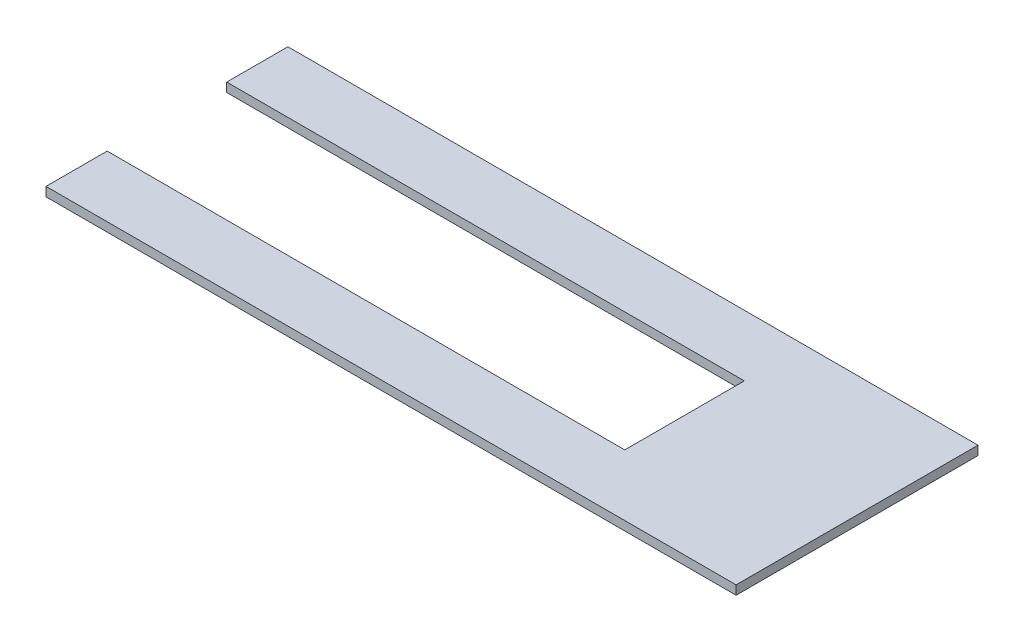
ISO-10303-21;
HEADER;
FILE_DESCRIPTION(('STEP AP214'),'2;1');
FILE_NAME('part.step','',(''),(''),'','','');
FILE_SCHEMA(('AUTOMOTIVE_DESIGN { 1 0 10303 214 1 1 1 1 }'));
ENDSEC;
DATA;
#1=APPLICATION_CONTEXT('core data for automotive mechanical design processes');
#2=APPLICATION_PROTOCOL_DEFINITION('international standard','automotive_design',2000,#1);
#3=PRODUCT_CONTEXT('',#1,'mechanical');
#4=PRODUCT('Part','Part','',(#3));
#5=PRODUCT_RELATED_PRODUCT_CATEGORY('part','',(#4));
#6=PRODUCT_DEFINITION_FORMATION('','',#4);
#7=PRODUCT_DEFINITION_CONTEXT('part definition',#1,'design');
#8=PRODUCT_DEFINITION('design','',#6,#7);
#9=PRODUCT_DEFINITION_SHAPE('','',#8);
#10=(LENGTH_UNIT() NAMED_UNIT(*) SI_UNIT(.MILLI.,.METRE.));
#11=(NAMED_UNIT(*) PLANE_ANGLE_UNIT() SI_UNIT($,.RADIAN.));
#12=(NAMED_UNIT(*) SI_UNIT($,.STERADIAN.) SOLID_ANGLE_UNIT());
#13=UNCERTAINTY_MEASURE_WITH_UNIT(LENGTH_MEASURE(1.E-05),#10,'distance_accuracy_value','');
#14=(GEOMETRIC_REPRESENTATION_CONTEXT(3) GLOBAL_UNCERTAINTY_ASSIGNED_CONTEXT((#13)) GLOBAL_UNIT_ASSIGNED_CONTEXT((#10,
#11,#12)) REPRESENTATION_CONTEXT('',''));
#15=CARTESIAN_POINT('',(0.,0.,0.));
#16=DIRECTION('',(0.,0.,1.));
#17=DIRECTION('',(1.,0.,0.));
#18=AXIS2_PLACEMENT_3D('',#15,#16,#17);
#19=CARTESIAN_POINT('',(242.193241980691,12.7,-82.));
#20=DIRECTION('',(1.,0.,0.));
#21=DIRECTION('',(0.,0.,-1.));
#22=AXIS2_PLACEMENT_3D('',#19,#20,#21);
#23=PLANE('',#22);
#24=DIRECTION('',(0.,0.,1.));
#25=VECTOR('',#24,1.);
#26=CARTESIAN_POINT('',(242.193241980691,0.,-82.));
#27=LINE('',#26,#25);
#28=CARTESIAN_POINT('',(242.193241980691,0.,-82.));
#29=VERTEX_POINT('',#28);
#30=CARTESIAN_POINT('',(242.193241980691,0.,86.0000000000002));
#31=VERTEX_POINT('',#30);
#32=EDGE_CURVE('E135',#29,#31,#27,.T.);
#33=ORIENTED_EDGE('',*,*,#32,.T.);
#34=DIRECTION('',(0.,-1.,0.));
#35=VECTOR('',#34,1.);
#36=CARTESIAN_POINT('',(242.193241980691,12.7,86.0000000000002));
#37=LINE('',#36,#35);
#38=CARTESIAN_POINT('',(242.193241980691,12.7,86.0000000000002));
#39=VERTEX_POINT('',#38);
#40=EDGE_CURVE('E11',#39,#31,#37,.T.);
#41=ORIENTED_EDGE('',*,*,#40,.F.);
#42=DIRECTION('',(0.,0.,1.));
#43=VECTOR('',#42,1.);
#44=CARTESIAN_POINT('',(242.193241980691,12.7,-82.));
#45=LINE('',#44,#43);
#46=CARTESIAN_POINT('',(242.193241980691,12.7,-82.));
#47=VERTEX_POINT('',#46);
#48=EDGE_CURVE('E152',#47,#39,#45,.T.);
#49=ORIENTED_EDGE('',*,*,#48,.F.);
#50=DIRECTION('',(0.,-1.,0.));
#51=VECTOR('',#50,1.);
#52=CARTESIAN_POINT('',(242.193241980691,12.7,-82.));
#53=LINE('',#52,#51);
#54=EDGE_CURVE('E134',#47,#29,#53,.T.);
#55=ORIENTED_EDGE('',*,*,#54,.T.);
#56=EDGE_LOOP('',(#33,#41,#49,#55));
#57=FACE_BOUND('',#56,.T.);
#58=ADVANCED_FACE('F37',(#57),#23,.F.);
#59=CARTESIAN_POINT('',(242.193241980691,12.7,86.0000000000002));
#60=DIRECTION('',(0.,0.,1.));
#61=DIRECTION('',(1.,0.,0.));
#62=AXIS2_PLACEMENT_3D('',#59,#60,#61);
#63=PLANE('',#62);
#64=DIRECTION('',(-1.,0.,0.));
#65=VECTOR('',#64,1.);
#66=CARTESIAN_POINT('',(242.193241980691,0.,86.0000000000002));
#67=LINE('',#66,#65);
#68=CARTESIAN_POINT('',(-485.306758019309,0.,86.0000000000002));
#69=VERTEX_POINT('',#68);
#70=EDGE_CURVE('E138',#31,#69,#67,.T.);
#71=ORIENTED_EDGE('',*,*,#70,.T.);
#72=DIRECTION('',(0.,-1.,0.));
#73=VECTOR('',#72,1.);
#74=CARTESIAN_POINT('',(-485.306758019309,12.7,86.0000000000002));
#75=LINE('',#74,#73);
#76=CARTESIAN_POINT('',(-485.306758019309,12.7,86.0000000000002));
#77=VERTEX_POINT('',#76);
#78=EDGE_CURVE('E45',#77,#69,#75,.T.);
#79=ORIENTED_EDGE('',*,*,#78,.F.);
#80=DIRECTION('',(-1.,0.,0.));
#81=VECTOR('',#80,1.);
#82=CARTESIAN_POINT('',(242.193241980691,12.7,86.0000000000002));
#83=LINE('',#82,#81);
#84=EDGE_CURVE('E95',#39,#77,#83,.T.);
#85=ORIENTED_EDGE('',*,*,#84,.F.);
#86=ORIENTED_EDGE('',*,*,#40,.T.);
#87=EDGE_LOOP('',(#71,#79,#85,#86));
#88=FACE_BOUND('',#87,.T.);
#89=ADVANCED_FACE('F180',(#88),#63,.F.);
#90=CARTESIAN_POINT('',(-485.306758019309,12.7,86.0000000000002));
#91=DIRECTION('',(1.,0.,0.));
#92=DIRECTION('',(0.,0.,-1.));
#93=AXIS2_PLACEMENT_3D('',#90,#91,#92);
#94=PLANE('',#93);
#95=DIRECTION('',(0.,0.,1.));
#96=VECTOR('',#95,1.);
#97=CARTESIAN_POINT('',(-485.306758019309,0.,86.0000000000002));
#98=LINE('',#97,#96);
#99=CARTESIAN_POINT('',(-485.306758019309,0.,172.));
#100=VERTEX_POINT('',#99);
#101=EDGE_CURVE('E140',#69,#100,#98,.T.);
#102=ORIENTED_EDGE('',*,*,#101,.T.);
#103=DIRECTION('',(0.,-1.,0.));
#104=VECTOR('',#103,1.);
#105=CARTESIAN_POINT('',(-485.306758019309,12.7,172.));
#106=LINE('',#105,#104);
#107=CARTESIAN_POINT('',(-485.306758019309,12.7,172.));
#108=VERTEX_POINT('',#107);
#109=EDGE_CURVE('E158',#108,#100,#106,.T.);
#110=ORIENTED_EDGE('',*,*,#109,.F.);
#111=DIRECTION('',(0.,0.,1.));
#112=VECTOR('',#111,1.);
#113=CARTESIAN_POINT('',(-485.306758019309,12.7,86.0000000000002));
#114=LINE('',#113,#112);
#115=EDGE_CURVE('E165',#77,#108,#114,.T.);
#116=ORIENTED_EDGE('',*,*,#115,.F.);
#117=ORIENTED_EDGE('',*,*,#78,.T.);
#118=EDGE_LOOP('',(#102,#110,#116,#117));
#119=FACE_BOUND('',#118,.T.);
#120=ADVANCED_FACE('F163',(#119),#94,.F.);
#121=CARTESIAN_POINT('',(484.693241980691,12.7,172.));
#122=DIRECTION('',(0.,0.,1.));
#123=DIRECTION('',(1.,0.,0.));
#124=AXIS2_PLACEMENT_3D('',#121,#122,#123);
#125=PLANE('',#124);
#126=DIRECTION('',(-1.,0.,0.));
#127=VECTOR('',#126,1.);
#128=CARTESIAN_POINT('',(484.693241980691,0.,172.));
#129=LINE('',#128,#127);
#130=CARTESIAN_POINT('',(484.693241980691,0.,172.));
#131=VERTEX_POINT('',#130);
#132=EDGE_CURVE('E143',#131,#100,#129,.T.);
#133=ORIENTED_EDGE('',*,*,#132,.F.);
#134=DIRECTION('',(0.,-1.,0.));
#135=VECTOR('',#134,1.);
#136=CARTESIAN_POINT('',(484.693241980691,12.7,172.));
#137=LINE('',#136,#135);
#138=CARTESIAN_POINT('',(484.693241980691,12.7,172.));
#139=VERTEX_POINT('',#138);
#140=EDGE_CURVE('E156',#139,#131,#137,.T.);
#141=ORIENTED_EDGE('',*,*,#140,.F.);
#142=DIRECTION('',(-1.,0.,0.));
#143=VECTOR('',#142,1.);
#144=CARTESIAN_POINT('',(484.693241980691,12.7,172.));
#145=LINE('',#144,#143);
#146=EDGE_CURVE('E129',#139,#108,#145,.T.);
#147=ORIENTED_EDGE('',*,*,#146,.T.);
#148=ORIENTED_EDGE('',*,*,#109,.T.);
#149=EDGE_LOOP('',(#133,#141,#147,#148));
#150=FACE_BOUND('',#149,.T.);
#151=ADVANCED_FACE('F172',(#150),#125,.T.);
#152=CARTESIAN_POINT('',(484.693241980691,12.7,-168.));
#153=DIRECTION('',(1.,0.,0.));
#154=DIRECTION('',(0.,0.,-1.));
#155=AXIS2_PLACEMENT_3D('',#152,#153,#154);
#156=PLANE('',#155);
#157=DIRECTION('',(0.,0.,1.));
#158=VECTOR('',#157,1.);
#159=CARTESIAN_POINT('',(484.693241980691,0.,-168.));
#160=LINE('',#159,#158);
#161=CARTESIAN_POINT('',(484.693241980691,0.,-168.));
#162=VERTEX_POINT('',#161);
#163=EDGE_CURVE('E146',#162,#131,#160,.T.);
#164=ORIENTED_EDGE('',*,*,#163,.F.);
#165=DIRECTION('',(0.,-1.,0.));
#166=VECTOR('',#165,1.);
#167=CARTESIAN_POINT('',(484.693241980691,12.7,-168.));
#168=LINE('',#167,#166);
#169=CARTESIAN_POINT('',(484.693241980691,12.7,-168.));
#170=VERTEX_POINT('',#169);
#171=EDGE_CURVE('E117',#170,#162,#168,.T.);
#172=ORIENTED_EDGE('',*,*,#171,.F.);
#173=DIRECTION('',(0.,0.,1.));
#174=VECTOR('',#173,1.);
#175=CARTESIAN_POINT('',(484.693241980691,12.7,-168.));
#176=LINE('',#175,#174);
#177=EDGE_CURVE('E127',#170,#139,#176,.T.);
#178=ORIENTED_EDGE('',*,*,#177,.T.);
#179=ORIENTED_EDGE('',*,*,#140,.T.);
#180=EDGE_LOOP('',(#164,#172,#178,#179));
#181=FACE_BOUND('',#180,.T.);
#182=ADVANCED_FACE('F190',(#181),#156,.T.);
#183=CARTESIAN_POINT('',(-485.306758019309,12.7,-168.));
#184=DIRECTION('',(0.,0.,-1.));
#185=DIRECTION('',(-1.,0.,0.));
#186=AXIS2_PLACEMENT_3D('',#183,#184,#185);
#187=PLANE('',#186);
#188=DIRECTION('',(1.,0.,0.));
#189=VECTOR('',#188,1.);
#190=CARTESIAN_POINT('',(-485.306758019309,0.,-168.));
#191=LINE('',#190,#189);
#192=CARTESIAN_POINT('',(-485.306758019309,0.,-168.));
#193=VERTEX_POINT('',#192);
#194=EDGE_CURVE('E116',#193,#162,#191,.T.);
#195=ORIENTED_EDGE('',*,*,#194,.F.);
#196=DIRECTION('',(0.,-1.,0.));
#197=VECTOR('',#196,1.);
#198=CARTESIAN_POINT('',(-485.306758019309,12.7,-168.));
#199=LINE('',#198,#197);
#200=CARTESIAN_POINT('',(-485.306758019309,12.7,-168.));
#201=VERTEX_POINT('',#200);
#202=EDGE_CURVE('E110',#201,#193,#199,.T.);
#203=ORIENTED_EDGE('',*,*,#202,.F.);
#204=DIRECTION('',(1.,0.,0.));
#205=VECTOR('',#204,1.);
#206=CARTESIAN_POINT('',(-485.306758019309,12.7,-168.));
#207=LINE('',#206,#205);
#208=EDGE_CURVE('E114',#201,#170,#207,.T.);
#209=ORIENTED_EDGE('',*,*,#208,.T.);
#210=ORIENTED_EDGE('',*,*,#171,.T.);
#211=EDGE_LOOP('',(#195,#203,#209,#210));
#212=FACE_BOUND('',#211,.T.);
#213=ADVANCED_FACE('F112',(#212),#187,.T.);
#214=CARTESIAN_POINT('',(-485.306758019309,12.7,-168.));
#215=DIRECTION('',(1.,0.,0.));
#216=DIRECTION('',(0.,0.,-1.));
#217=AXIS2_PLACEMENT_3D('',#214,#215,#216);
#218=PLANE('',#217);
#219=DIRECTION('',(0.,0.,1.));
#220=VECTOR('',#219,1.);
#221=CARTESIAN_POINT('',(-485.306758019309,0.,-168.));
#222=LINE('',#221,#220);
#223=CARTESIAN_POINT('',(-485.306758019309,0.,-82.));
#224=VERTEX_POINT('',#223);
#225=EDGE_CURVE('E81',#193,#224,#222,.T.);
#226=ORIENTED_EDGE('',*,*,#225,.T.);
#227=DIRECTION('',(0.,-1.,0.));
#228=VECTOR('',#227,1.);
#229=CARTESIAN_POINT('',(-485.306758019309,12.7,-82.));
#230=LINE('',#229,#228);
#231=CARTESIAN_POINT('',(-485.306758019309,12.7,-82.));
#232=VERTEX_POINT('',#231);
#233=EDGE_CURVE('E118',#232,#224,#230,.T.);
#234=ORIENTED_EDGE('',*,*,#233,.F.);
#235=DIRECTION('',(0.,0.,1.));
#236=VECTOR('',#235,1.);
#237=CARTESIAN_POINT('',(-485.306758019309,12.7,-168.));
#238=LINE('',#237,#236);
#239=EDGE_CURVE('E120',#201,#232,#238,.T.);
#240=ORIENTED_EDGE('',*,*,#239,.F.);
#241=ORIENTED_EDGE('',*,*,#202,.T.);
#242=EDGE_LOOP('',(#226,#234,#240,#241));
#243=FACE_BOUND('',#242,.T.);
#244=ADVANCED_FACE('F121',(#243),#218,.F.);
#245=CARTESIAN_POINT('',(-485.306758019309,12.7,-82.));
#246=DIRECTION('',(0.,0.,-1.));
#247=DIRECTION('',(-1.,0.,0.));
#248=AXIS2_PLACEMENT_3D('',#245,#246,#247);
#249=PLANE('',#248);
#250=DIRECTION('',(1.,0.,0.));
#251=VECTOR('',#250,1.);
#252=CARTESIAN_POINT('',(-485.306758019309,0.,-82.));
#253=LINE('',#252,#251);
#254=EDGE_CURVE('E87',#224,#29,#253,.T.);
#255=ORIENTED_EDGE('',*,*,#254,.T.);
#256=ORIENTED_EDGE('',*,*,#54,.F.);
#257=DIRECTION('',(1.,0.,0.));
#258=VECTOR('',#257,1.);
#259=CARTESIAN_POINT('',(-485.306758019309,12.7,-82.));
#260=LINE('',#259,#258);
#261=EDGE_CURVE('E53',#232,#47,#260,.T.);
#262=ORIENTED_EDGE('',*,*,#261,.F.);
#263=ORIENTED_EDGE('',*,*,#233,.T.);
#264=EDGE_LOOP('',(#255,#256,#262,#263));
#265=FACE_BOUND('',#264,.T.);
#266=ADVANCED_FACE('F198',(#265),#249,.F.);
#267=CARTESIAN_POINT('',(0.,12.7,0.));
#268=DIRECTION('',(0.,-1.,0.));
#269=DIRECTION('',(0.,0.,-1.));
#270=AXIS2_PLACEMENT_3D('',#267,#268,#269);
#271=PLANE('',#270);
#272=ORIENTED_EDGE('',*,*,#48,.T.);
#273=ORIENTED_EDGE('',*,*,#84,.T.);
#274=ORIENTED_EDGE('',*,*,#115,.T.);
#275=ORIENTED_EDGE('',*,*,#146,.F.);
#276=ORIENTED_EDGE('',*,*,#177,.F.);
#277=ORIENTED_EDGE('',*,*,#208,.F.);
#278=ORIENTED_EDGE('',*,*,#239,.T.);
#279=ORIENTED_EDGE('',*,*,#261,.T.);
#280=EDGE_LOOP('',(#272,#273,#274,#275,#276,#277,#278,#279));
#281=FACE_BOUND('',#280,.T.);
#282=ADVANCED_FACE('F124',(#281),#271,.F.);
#283=CARTESIAN_POINT('',(0.,0.,0.));
#284=DIRECTION('',(0.,-1.,0.));
#285=DIRECTION('',(0.,0.,-1.));
#286=AXIS2_PLACEMENT_3D('',#283,#284,#285);
#287=PLANE('',#286);
#288=ORIENTED_EDGE('',*,*,#32,.F.);
#289=ORIENTED_EDGE('',*,*,#254,.F.);
#290=ORIENTED_EDGE('',*,*,#225,.F.);
#291=ORIENTED_EDGE('',*,*,#194,.T.);
#292=ORIENTED_EDGE('',*,*,#163,.T.);
#293=ORIENTED_EDGE('',*,*,#132,.T.);
#294=ORIENTED_EDGE('',*,*,#101,.F.);
#295=ORIENTED_EDGE('',*,*,#70,.F.);
#296=EDGE_LOOP('',(#288,#289,#290,#291,#292,#293,#294,#295));
#297=FACE_BOUND('',#296,.T.);
#298=ADVANCED_FACE('F168',(#297),#287,.T.);
#299=CLOSED_SHELL('',(#58,#89,#120,#151,#182,#213,#244,#266,#282,#298));
#300=MANIFOLD_SOLID_BREP('B2',#299);
#301=ADVANCED_BREP_SHAPE_REPRESENTATION('',(#18,#300),#14);
#302=SHAPE_DEFINITION_REPRESENTATION(#9,#301);
ENDSEC;
END-ISO-10303-21;
